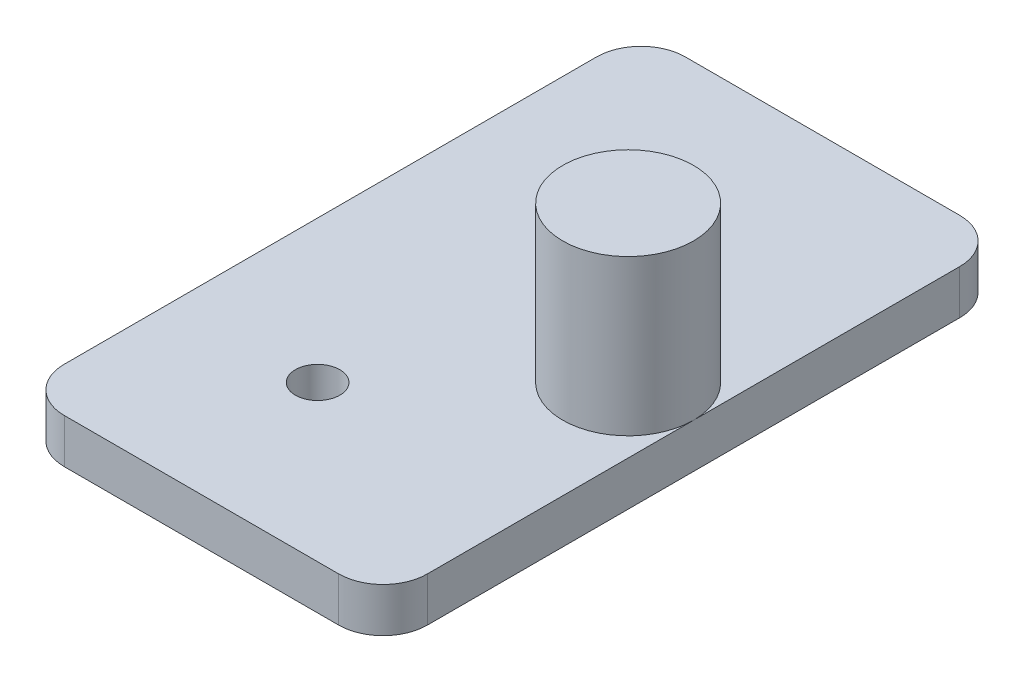
ISO-10303-21;
HEADER;
FILE_DESCRIPTION(('STEP AP214'),'2;1');
FILE_NAME('part.step','',(''),(''),'','','');
FILE_SCHEMA(('AUTOMOTIVE_DESIGN { 1 0 10303 214 1 1 1 1 }'));
ENDSEC;
DATA;
#1=APPLICATION_CONTEXT('core data for automotive mechanical design processes');
#2=APPLICATION_PROTOCOL_DEFINITION('international standard','automotive_design',2000,#1);
#3=PRODUCT_CONTEXT('',#1,'mechanical');
#4=PRODUCT('Part','Part','',(#3));
#5=PRODUCT_RELATED_PRODUCT_CATEGORY('part','',(#4));
#6=PRODUCT_DEFINITION_FORMATION('','',#4);
#7=PRODUCT_DEFINITION_CONTEXT('part definition',#1,'design');
#8=PRODUCT_DEFINITION('design','',#6,#7);
#9=PRODUCT_DEFINITION_SHAPE('','',#8);
#10=(LENGTH_UNIT() NAMED_UNIT(*) SI_UNIT(.MILLI.,.METRE.));
#11=(NAMED_UNIT(*) PLANE_ANGLE_UNIT() SI_UNIT($,.RADIAN.));
#12=(NAMED_UNIT(*) SI_UNIT($,.STERADIAN.) SOLID_ANGLE_UNIT());
#13=UNCERTAINTY_MEASURE_WITH_UNIT(LENGTH_MEASURE(1.E-05),#10,'distance_accuracy_value','');
#14=(GEOMETRIC_REPRESENTATION_CONTEXT(3) GLOBAL_UNCERTAINTY_ASSIGNED_CONTEXT((#13)) GLOBAL_UNIT_ASSIGNED_CONTEXT((#10,
#11,#12)) REPRESENTATION_CONTEXT('',''));
#15=CARTESIAN_POINT('',(0.,0.,0.));
#16=DIRECTION('',(0.,0.,1.));
#17=DIRECTION('',(1.,0.,0.));
#18=AXIS2_PLACEMENT_3D('',#15,#16,#17);
#19=CARTESIAN_POINT('',(17.5,9.,0.));
#20=DIRECTION('',(0.,-1.,0.));
#21=DIRECTION('',(0.,0.,-1.));
#22=AXIS2_PLACEMENT_3D('',#19,#20,#21);
#23=CYLINDRICAL_SURFACE('',#22,2.95);
#24=CARTESIAN_POINT('',(17.5,2.,0.));
#25=DIRECTION('',(0.,1.,0.));
#26=DIRECTION('',(0.,0.,1.));
#27=AXIS2_PLACEMENT_3D('',#24,#25,#26);
#28=CIRCLE('',#27,2.95);
#29=CARTESIAN_POINT('',(20.45,2.,0.));
#30=VERTEX_POINT('',#29);
#31=EDGE_CURVE('E113',#30,#30,#28,.T.);
#32=ORIENTED_EDGE('',*,*,#31,.T.);
#33=EDGE_LOOP('',(#32));
#34=FACE_BOUND('',#33,.T.);
#35=CARTESIAN_POINT('',(17.5,9.,0.));
#36=DIRECTION('',(0.,1.,0.));
#37=DIRECTION('',(0.,0.,1.));
#38=AXIS2_PLACEMENT_3D('',#35,#36,#37);
#39=CIRCLE('',#38,2.95);
#40=CARTESIAN_POINT('',(17.5,9.,2.95));
#41=VERTEX_POINT('',#40);
#42=EDGE_CURVE('E119',#41,#41,#39,.T.);
#43=ORIENTED_EDGE('',*,*,#42,.F.);
#44=EDGE_LOOP('',(#43));
#45=FACE_BOUND('',#44,.T.);
#46=ADVANCED_FACE('F38',(#34,#45),#23,.T.);
#47=CARTESIAN_POINT('',(17.5,9.,0.));
#48=DIRECTION('',(0.,1.,0.));
#49=DIRECTION('',(0.,0.,1.));
#50=AXIS2_PLACEMENT_3D('',#47,#48,#49);
#51=PLANE('',#50);
#52=ORIENTED_EDGE('',*,*,#42,.T.);
#53=EDGE_LOOP('',(#52));
#54=FACE_BOUND('',#53,.T.);
#55=ADVANCED_FACE('F215',(#54),#51,.T.);
#56=CARTESIAN_POINT('',(20.45,2.,14.));
#57=DIRECTION('',(-1.,0.,0.));
#58=DIRECTION('',(0.,0.,1.));
#59=AXIS2_PLACEMENT_3D('',#56,#57,#58);
#60=PLANE('',#59);
#61=DIRECTION('',(0.,0.,-1.));
#62=VECTOR('',#61,1.);
#63=CARTESIAN_POINT('',(20.45,2.,14.));
#64=LINE('',#63,#62);
#65=CARTESIAN_POINT('',(20.45,2.,12.));
#66=VERTEX_POINT('',#65);
#67=EDGE_CURVE('E106',#66,#30,#64,.T.);
#68=ORIENTED_EDGE('',*,*,#67,.F.);
#69=DIRECTION('',(0.,-1.,0.));
#70=VECTOR('',#69,1.);
#71=CARTESIAN_POINT('',(20.45,2.,12.));
#72=LINE('',#71,#70);
#73=CARTESIAN_POINT('',(20.45,0.,12.));
#74=VERTEX_POINT('',#73);
#75=EDGE_CURVE('E148',#66,#74,#72,.T.);
#76=ORIENTED_EDGE('',*,*,#75,.T.);
#77=DIRECTION('',(0.,0.,-1.));
#78=VECTOR('',#77,1.);
#79=CARTESIAN_POINT('',(20.45,0.,14.));
#80=LINE('',#79,#78);
#81=CARTESIAN_POINT('',(20.45,0.,-12.0000000000001));
#82=VERTEX_POINT('',#81);
#83=EDGE_CURVE('E138',#74,#82,#80,.T.);
#84=ORIENTED_EDGE('',*,*,#83,.T.);
#85=DIRECTION('',(0.,-1.,0.));
#86=VECTOR('',#85,1.);
#87=CARTESIAN_POINT('',(20.45,2.,-12.0000000000001));
#88=LINE('',#87,#86);
#89=CARTESIAN_POINT('',(20.45,2.,-12.0000000000001));
#90=VERTEX_POINT('',#89);
#91=EDGE_CURVE('E125',#82,#90,#88,.F.);
#92=ORIENTED_EDGE('',*,*,#91,.T.);
#93=EDGE_CURVE('E120',#30,#90,#64,.T.);
#94=ORIENTED_EDGE('',*,*,#93,.F.);
#95=EDGE_LOOP('',(#68,#76,#84,#92,#94));
#96=FACE_BOUND('',#95,.T.);
#97=ADVANCED_FACE('F122',(#96),#60,.F.);
#98=CARTESIAN_POINT('',(0.,2.,0.));
#99=DIRECTION('',(0.,1.,0.));
#100=DIRECTION('',(0.,0.,1.));
#101=AXIS2_PLACEMENT_3D('',#98,#99,#100);
#102=PLANE('',#101);
#103=CARTESIAN_POINT('',(10.5,2.,7.));
#104=DIRECTION('',(0.,1.,0.));
#105=DIRECTION('',(0.,0.,1.));
#106=AXIS2_PLACEMENT_3D('',#103,#104,#105);
#107=CIRCLE('',#106,1.);
#108=CARTESIAN_POINT('',(10.5,2.,8.));
#109=VERTEX_POINT('',#108);
#110=EDGE_CURVE('E135',#109,#109,#107,.T.);
#111=ORIENTED_EDGE('',*,*,#110,.F.);
#112=EDGE_LOOP('',(#111));
#113=FACE_BOUND('',#112,.T.);
#114=DIRECTION('',(1.,0.,0.));
#115=VECTOR('',#114,1.);
#116=CARTESIAN_POINT('',(4.0782633568577,2.,14.));
#117=LINE('',#116,#115);
#118=CARTESIAN_POINT('',(6.0782633568577,2.,14.));
#119=VERTEX_POINT('',#118);
#120=CARTESIAN_POINT('',(18.45,2.,14.));
#121=VERTEX_POINT('',#120);
#122=EDGE_CURVE('E127',#119,#121,#117,.T.);
#123=ORIENTED_EDGE('',*,*,#122,.T.);
#124=CARTESIAN_POINT('',(18.45,2.,12.));
#125=DIRECTION('',(0.,1.,0.));
#126=DIRECTION('',(0.,0.,1.));
#127=AXIS2_PLACEMENT_3D('',#124,#125,#126);
#128=CIRCLE('',#127,2.);
#129=EDGE_CURVE('E115',#121,#66,#128,.T.);
#130=ORIENTED_EDGE('',*,*,#129,.T.);
#131=ORIENTED_EDGE('',*,*,#67,.T.);
#132=ORIENTED_EDGE('',*,*,#31,.F.);
#133=ORIENTED_EDGE('',*,*,#93,.T.);
#134=CARTESIAN_POINT('',(18.45,2.,-12.0000000000001));
#135=DIRECTION('',(0.,1.,0.));
#136=DIRECTION('',(0.,0.,1.));
#137=AXIS2_PLACEMENT_3D('',#134,#135,#136);
#138=CIRCLE('',#137,2.);
#139=CARTESIAN_POINT('',(18.4500000000001,2.,-14.));
#140=VERTEX_POINT('',#139);
#141=EDGE_CURVE('E163',#90,#140,#138,.T.);
#142=ORIENTED_EDGE('',*,*,#141,.T.);
#143=DIRECTION('',(-1.,0.,0.));
#144=VECTOR('',#143,1.);
#145=CARTESIAN_POINT('',(20.,2.,-14.));
#146=LINE('',#145,#144);
#147=CARTESIAN_POINT('',(6.07826335685776,2.,-14.));
#148=VERTEX_POINT('',#147);
#149=EDGE_CURVE('E143',#140,#148,#146,.T.);
#150=ORIENTED_EDGE('',*,*,#149,.T.);
#151=CARTESIAN_POINT('',(6.0782633568577,2.,-12.0000000000004));
#152=DIRECTION('',(0.,1.,0.));
#153=DIRECTION('',(0.,0.,1.));
#154=AXIS2_PLACEMENT_3D('',#151,#152,#153);
#155=CIRCLE('',#154,2.);
#156=CARTESIAN_POINT('',(4.0782633568577,2.,-12.0000000000004));
#157=VERTEX_POINT('',#156);
#158=EDGE_CURVE('E60',#148,#157,#155,.T.);
#159=ORIENTED_EDGE('',*,*,#158,.T.);
#160=DIRECTION('',(0.,0.,1.));
#161=VECTOR('',#160,1.);
#162=CARTESIAN_POINT('',(4.0782633568577,2.,-14.));
#163=LINE('',#162,#161);
#164=CARTESIAN_POINT('',(4.0782633568577,2.,12.));
#165=VERTEX_POINT('',#164);
#166=EDGE_CURVE('E128',#157,#165,#163,.T.);
#167=ORIENTED_EDGE('',*,*,#166,.T.);
#168=CARTESIAN_POINT('',(6.0782633568577,2.,12.));
#169=DIRECTION('',(0.,1.,0.));
#170=DIRECTION('',(0.,0.,1.));
#171=AXIS2_PLACEMENT_3D('',#168,#169,#170);
#172=CIRCLE('',#171,2.);
#173=EDGE_CURVE('E166',#165,#119,#172,.T.);
#174=ORIENTED_EDGE('',*,*,#173,.T.);
#175=EDGE_LOOP('',(#123,#130,#131,#132,#133,#142,#150,#159,#167,#174));
#176=FACE_BOUND('',#175,.T.);
#177=CARTESIAN_POINT('',(10.5,2.,-7.));
#178=DIRECTION('',(0.,1.,0.));
#179=DIRECTION('',(0.,0.,1.));
#180=AXIS2_PLACEMENT_3D('',#177,#178,#179);
#181=CIRCLE('',#180,1.);
#182=CARTESIAN_POINT('',(10.5,2.,-6.));
#183=VERTEX_POINT('',#182);
#184=EDGE_CURVE('E195',#183,#183,#181,.T.);
#185=ORIENTED_EDGE('',*,*,#184,.F.);
#186=EDGE_LOOP('',(#185));
#187=FACE_BOUND('',#186,.T.);
#188=ADVANCED_FACE('F109',(#113,#176,#187),#102,.T.);
#189=CARTESIAN_POINT('',(4.0782633568577,2.,-14.));
#190=DIRECTION('',(1.,0.,0.));
#191=DIRECTION('',(0.,0.,-1.));
#192=AXIS2_PLACEMENT_3D('',#189,#190,#191);
#193=PLANE('',#192);
#194=DIRECTION('',(0.,0.,1.));
#195=VECTOR('',#194,1.);
#196=CARTESIAN_POINT('',(4.0782633568577,0.,-14.));
#197=LINE('',#196,#195);
#198=CARTESIAN_POINT('',(4.0782633568577,0.,-12.0000000000004));
#199=VERTEX_POINT('',#198);
#200=CARTESIAN_POINT('',(4.0782633568577,0.,12.));
#201=VERTEX_POINT('',#200);
#202=EDGE_CURVE('E132',#199,#201,#197,.T.);
#203=ORIENTED_EDGE('',*,*,#202,.T.);
#204=DIRECTION('',(0.,-1.,0.));
#205=VECTOR('',#204,1.);
#206=CARTESIAN_POINT('',(4.0782633568577,2.,12.));
#207=LINE('',#206,#205);
#208=EDGE_CURVE('E53',#201,#165,#207,.F.);
#209=ORIENTED_EDGE('',*,*,#208,.T.);
#210=ORIENTED_EDGE('',*,*,#166,.F.);
#211=DIRECTION('',(0.,-1.,0.));
#212=VECTOR('',#211,1.);
#213=CARTESIAN_POINT('',(4.0782633568577,2.,-12.0000000000004));
#214=LINE('',#213,#212);
#215=EDGE_CURVE('E169',#157,#199,#214,.T.);
#216=ORIENTED_EDGE('',*,*,#215,.T.);
#217=EDGE_LOOP('',(#203,#209,#210,#216));
#218=FACE_BOUND('',#217,.T.);
#219=ADVANCED_FACE('F188',(#218),#193,.F.);
#220=CARTESIAN_POINT('',(20.,2.,14.));
#221=DIRECTION('',(0.,0.,-1.));
#222=DIRECTION('',(-1.,0.,0.));
#223=AXIS2_PLACEMENT_3D('',#220,#221,#222);
#224=PLANE('',#223);
#225=DIRECTION('',(1.,0.,0.));
#226=VECTOR('',#225,1.);
#227=CARTESIAN_POINT('',(20.,0.,14.));
#228=LINE('',#227,#226);
#229=CARTESIAN_POINT('',(6.0782633568577,0.,14.));
#230=VERTEX_POINT('',#229);
#231=CARTESIAN_POINT('',(18.45,0.,14.));
#232=VERTEX_POINT('',#231);
#233=EDGE_CURVE('E134',#230,#232,#228,.T.);
#234=ORIENTED_EDGE('',*,*,#233,.T.);
#235=DIRECTION('',(0.,-1.,0.));
#236=VECTOR('',#235,1.);
#237=CARTESIAN_POINT('',(18.45,2.,14.));
#238=LINE('',#237,#236);
#239=EDGE_CURVE('E161',#232,#121,#238,.F.);
#240=ORIENTED_EDGE('',*,*,#239,.T.);
#241=ORIENTED_EDGE('',*,*,#122,.F.);
#242=DIRECTION('',(0.,-1.,0.));
#243=VECTOR('',#242,1.);
#244=CARTESIAN_POINT('',(6.0782633568577,2.,14.));
#245=LINE('',#244,#243);
#246=EDGE_CURVE('E158',#119,#230,#245,.T.);
#247=ORIENTED_EDGE('',*,*,#246,.T.);
#248=EDGE_LOOP('',(#234,#240,#241,#247));
#249=FACE_BOUND('',#248,.T.);
#250=ADVANCED_FACE('F213',(#249),#224,.F.);
#251=CARTESIAN_POINT('',(20.45,2.,-14.));
#252=DIRECTION('',(0.,0.,1.));
#253=DIRECTION('',(1.,0.,0.));
#254=AXIS2_PLACEMENT_3D('',#251,#252,#253);
#255=PLANE('',#254);
#256=DIRECTION('',(-1.,0.,0.));
#257=VECTOR('',#256,1.);
#258=CARTESIAN_POINT('',(20.45,0.,-14.));
#259=LINE('',#258,#257);
#260=CARTESIAN_POINT('',(18.4500000000001,0.,-14.0000000000001));
#261=VERTEX_POINT('',#260);
#262=CARTESIAN_POINT('',(6.07826335685776,0.,-14.0000000000004));
#263=VERTEX_POINT('',#262);
#264=EDGE_CURVE('E140',#261,#263,#259,.T.);
#265=ORIENTED_EDGE('',*,*,#264,.T.);
#266=DIRECTION('',(0.,-1.,0.));
#267=VECTOR('',#266,1.);
#268=CARTESIAN_POINT('',(6.07826335685776,2.,-14.0000000000004));
#269=LINE('',#268,#267);
#270=EDGE_CURVE('E11',#263,#148,#269,.F.);
#271=ORIENTED_EDGE('',*,*,#270,.T.);
#272=ORIENTED_EDGE('',*,*,#149,.F.);
#273=DIRECTION('',(0.,-1.,0.));
#274=VECTOR('',#273,1.);
#275=CARTESIAN_POINT('',(18.4500000000001,2.,-14.0000000000001));
#276=LINE('',#275,#274);
#277=EDGE_CURVE('E46',#140,#261,#276,.T.);
#278=ORIENTED_EDGE('',*,*,#277,.T.);
#279=EDGE_LOOP('',(#265,#271,#272,#278));
#280=FACE_BOUND('',#279,.T.);
#281=ADVANCED_FACE('F177',(#280),#255,.F.);
#282=CARTESIAN_POINT('',(10.5,2.,7.));
#283=DIRECTION('',(0.,-1.,0.));
#284=DIRECTION('',(0.,0.,-1.));
#285=AXIS2_PLACEMENT_3D('',#282,#283,#284);
#286=CYLINDRICAL_SURFACE('',#285,1.);
#287=ORIENTED_EDGE('',*,*,#110,.T.);
#288=EDGE_LOOP('',(#287));
#289=FACE_BOUND('',#288,.T.);
#290=CARTESIAN_POINT('',(10.5,0.,7.));
#291=DIRECTION('',(0.,1.,0.));
#292=DIRECTION('',(0.,0.,1.));
#293=AXIS2_PLACEMENT_3D('',#290,#291,#292);
#294=CIRCLE('',#293,1.);
#295=CARTESIAN_POINT('',(10.5,0.,8.));
#296=VERTEX_POINT('',#295);
#297=EDGE_CURVE('E192',#296,#296,#294,.T.);
#298=ORIENTED_EDGE('',*,*,#297,.F.);
#299=EDGE_LOOP('',(#298));
#300=FACE_BOUND('',#299,.T.);
#301=ADVANCED_FACE('F279',(#289,#300),#286,.F.);
#302=CARTESIAN_POINT('',(10.5,2.,-7.));
#303=DIRECTION('',(0.,-1.,0.));
#304=DIRECTION('',(0.,0.,-1.));
#305=AXIS2_PLACEMENT_3D('',#302,#303,#304);
#306=CYLINDRICAL_SURFACE('',#305,1.);
#307=ORIENTED_EDGE('',*,*,#184,.T.);
#308=EDGE_LOOP('',(#307));
#309=FACE_BOUND('',#308,.T.);
#310=CARTESIAN_POINT('',(10.5,0.,-7.));
#311=DIRECTION('',(0.,1.,0.));
#312=DIRECTION('',(0.,0.,1.));
#313=AXIS2_PLACEMENT_3D('',#310,#311,#312);
#314=CIRCLE('',#313,1.);
#315=CARTESIAN_POINT('',(10.5,0.,-6.));
#316=VERTEX_POINT('',#315);
#317=EDGE_CURVE('E198',#316,#316,#314,.T.);
#318=ORIENTED_EDGE('',*,*,#317,.F.);
#319=EDGE_LOOP('',(#318));
#320=FACE_BOUND('',#319,.T.);
#321=ADVANCED_FACE('F204',(#309,#320),#306,.F.);
#322=CARTESIAN_POINT('',(17.5,0.,0.));
#323=DIRECTION('',(0.,1.,0.));
#324=DIRECTION('',(0.,0.,1.));
#325=AXIS2_PLACEMENT_3D('',#322,#323,#324);
#326=PLANE('',#325);
#327=ORIENTED_EDGE('',*,*,#83,.F.);
#328=CARTESIAN_POINT('',(18.45,0.,12.));
#329=DIRECTION('',(0.,1.,0.));
#330=DIRECTION('',(0.,0.,1.));
#331=AXIS2_PLACEMENT_3D('',#328,#329,#330);
#332=CIRCLE('',#331,2.);
#333=EDGE_CURVE('E156',#74,#232,#332,.F.);
#334=ORIENTED_EDGE('',*,*,#333,.T.);
#335=ORIENTED_EDGE('',*,*,#233,.F.);
#336=CARTESIAN_POINT('',(6.0782633568577,0.,12.));
#337=DIRECTION('',(0.,1.,0.));
#338=DIRECTION('',(0.,0.,1.));
#339=AXIS2_PLACEMENT_3D('',#336,#337,#338);
#340=CIRCLE('',#339,2.);
#341=EDGE_CURVE('E154',#230,#201,#340,.F.);
#342=ORIENTED_EDGE('',*,*,#341,.T.);
#343=ORIENTED_EDGE('',*,*,#202,.F.);
#344=CARTESIAN_POINT('',(6.0782633568577,0.,-12.0000000000004));
#345=DIRECTION('',(0.,1.,0.));
#346=DIRECTION('',(0.,0.,1.));
#347=AXIS2_PLACEMENT_3D('',#344,#345,#346);
#348=CIRCLE('',#347,2.);
#349=EDGE_CURVE('E152',#199,#263,#348,.F.);
#350=ORIENTED_EDGE('',*,*,#349,.T.);
#351=ORIENTED_EDGE('',*,*,#264,.F.);
#352=CARTESIAN_POINT('',(18.45,0.,-12.0000000000001));
#353=DIRECTION('',(0.,1.,0.));
#354=DIRECTION('',(0.,0.,1.));
#355=AXIS2_PLACEMENT_3D('',#352,#353,#354);
#356=CIRCLE('',#355,2.);
#357=EDGE_CURVE('E150',#261,#82,#356,.F.);
#358=ORIENTED_EDGE('',*,*,#357,.T.);
#359=EDGE_LOOP('',(#327,#334,#335,#342,#343,#350,#351,#358));
#360=FACE_BOUND('',#359,.T.);
#361=ORIENTED_EDGE('',*,*,#297,.T.);
#362=EDGE_LOOP('',(#361));
#363=FACE_BOUND('',#362,.T.);
#364=ORIENTED_EDGE('',*,*,#317,.T.);
#365=EDGE_LOOP('',(#364));
#366=FACE_BOUND('',#365,.T.);
#367=ADVANCED_FACE('F182',(#360,#363,#366),#326,.F.);
#368=CARTESIAN_POINT('',(18.45,2.,12.));
#369=DIRECTION('',(0.,-1.,0.));
#370=DIRECTION('',(0.,0.,-1.));
#371=AXIS2_PLACEMENT_3D('',#368,#369,#370);
#372=CYLINDRICAL_SURFACE('',#371,2.);
#373=ORIENTED_EDGE('',*,*,#129,.F.);
#374=ORIENTED_EDGE('',*,*,#239,.F.);
#375=ORIENTED_EDGE('',*,*,#333,.F.);
#376=ORIENTED_EDGE('',*,*,#75,.F.);
#377=EDGE_LOOP('',(#373,#374,#375,#376));
#378=FACE_BOUND('',#377,.T.);
#379=ADVANCED_FACE('F231',(#378),#372,.T.);
#380=CARTESIAN_POINT('',(6.0782633568577,2.,12.));
#381=DIRECTION('',(0.,-1.,0.));
#382=DIRECTION('',(0.,0.,-1.));
#383=AXIS2_PLACEMENT_3D('',#380,#381,#382);
#384=CYLINDRICAL_SURFACE('',#383,2.);
#385=ORIENTED_EDGE('',*,*,#173,.F.);
#386=ORIENTED_EDGE('',*,*,#208,.F.);
#387=ORIENTED_EDGE('',*,*,#341,.F.);
#388=ORIENTED_EDGE('',*,*,#246,.F.);
#389=EDGE_LOOP('',(#385,#386,#387,#388));
#390=FACE_BOUND('',#389,.T.);
#391=ADVANCED_FACE('F234',(#390),#384,.T.);
#392=CARTESIAN_POINT('',(6.0782633568577,2.,-12.0000000000004));
#393=DIRECTION('',(0.,-1.,0.));
#394=DIRECTION('',(0.,0.,-1.));
#395=AXIS2_PLACEMENT_3D('',#392,#393,#394);
#396=CYLINDRICAL_SURFACE('',#395,2.);
#397=ORIENTED_EDGE('',*,*,#158,.F.);
#398=ORIENTED_EDGE('',*,*,#270,.F.);
#399=ORIENTED_EDGE('',*,*,#349,.F.);
#400=ORIENTED_EDGE('',*,*,#215,.F.);
#401=EDGE_LOOP('',(#397,#398,#399,#400));
#402=FACE_BOUND('',#401,.T.);
#403=ADVANCED_FACE('F187',(#402),#396,.T.);
#404=CARTESIAN_POINT('',(18.45,2.,-12.0000000000001));
#405=DIRECTION('',(0.,-1.,0.));
#406=DIRECTION('',(0.,0.,-1.));
#407=AXIS2_PLACEMENT_3D('',#404,#405,#406);
#408=CYLINDRICAL_SURFACE('',#407,2.);
#409=ORIENTED_EDGE('',*,*,#141,.F.);
#410=ORIENTED_EDGE('',*,*,#91,.F.);
#411=ORIENTED_EDGE('',*,*,#357,.F.);
#412=ORIENTED_EDGE('',*,*,#277,.F.);
#413=EDGE_LOOP('',(#409,#410,#411,#412));
#414=FACE_BOUND('',#413,.T.);
#415=ADVANCED_FACE('F40',(#414),#408,.T.);
#416=CLOSED_SHELL('',(#46,#55,#97,#188,#219,#250,#281,#301,#321,#367,#379,#391,#403,#415));
#417=MANIFOLD_SOLID_BREP('B2',#416);
#418=ADVANCED_BREP_SHAPE_REPRESENTATION('',(#18,#417),#14);
#419=SHAPE_DEFINITION_REPRESENTATION(#9,#418);
ENDSEC;
END-ISO-10303-21;
